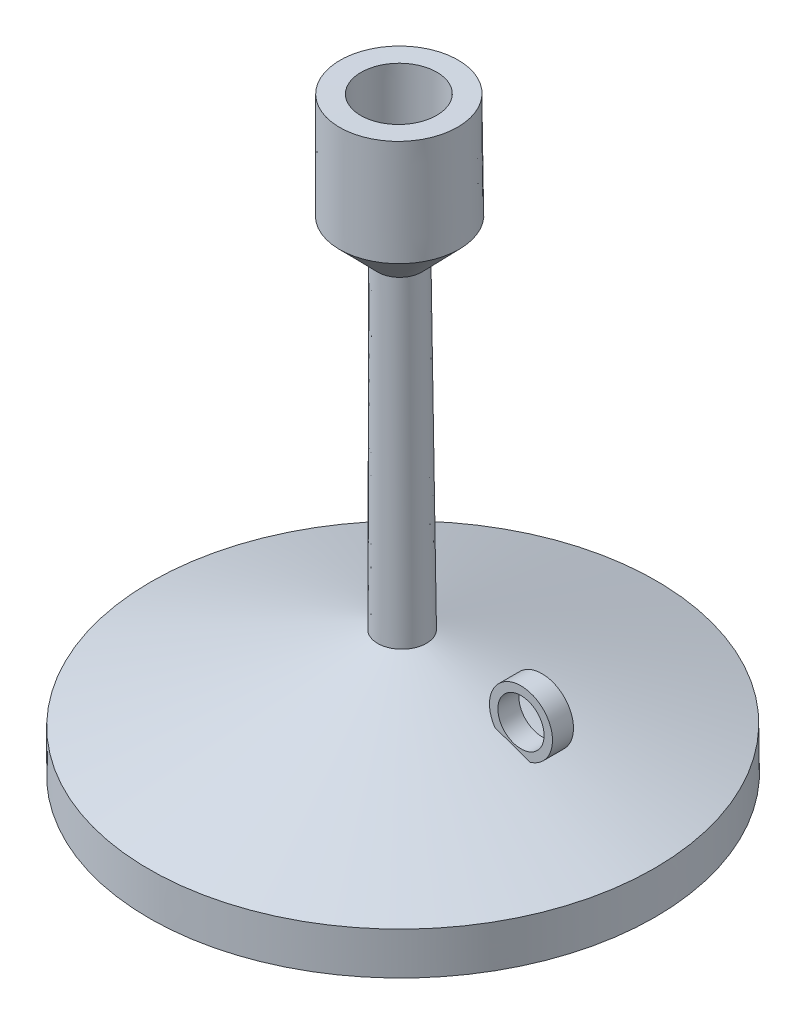
ISO-10303-21;
HEADER;
FILE_DESCRIPTION(('STEP AP214'),'2;1');
FILE_NAME('part.step','',(''),(''),'','','');
FILE_SCHEMA(('AUTOMOTIVE_DESIGN { 1 0 10303 214 1 1 1 1 }'));
ENDSEC;
DATA;
#1=APPLICATION_CONTEXT('core data for automotive mechanical design processes');
#2=APPLICATION_PROTOCOL_DEFINITION('international standard','automotive_design',2000,#1);
#3=PRODUCT_CONTEXT('',#1,'mechanical');
#4=PRODUCT('Part','Part','',(#3));
#5=PRODUCT_RELATED_PRODUCT_CATEGORY('part','',(#4));
#6=PRODUCT_DEFINITION_FORMATION('','',#4);
#7=PRODUCT_DEFINITION_CONTEXT('part definition',#1,'design');
#8=PRODUCT_DEFINITION('design','',#6,#7);
#9=PRODUCT_DEFINITION_SHAPE('','',#8);
#10=(LENGTH_UNIT() NAMED_UNIT(*) SI_UNIT(.MILLI.,.METRE.));
#11=(NAMED_UNIT(*) PLANE_ANGLE_UNIT() SI_UNIT($,.RADIAN.));
#12=(NAMED_UNIT(*) SI_UNIT($,.STERADIAN.) SOLID_ANGLE_UNIT());
#13=UNCERTAINTY_MEASURE_WITH_UNIT(LENGTH_MEASURE(1.E-05),#10,'distance_accuracy_value','');
#14=(GEOMETRIC_REPRESENTATION_CONTEXT(3) GLOBAL_UNCERTAINTY_ASSIGNED_CONTEXT((#13)) GLOBAL_UNIT_ASSIGNED_CONTEXT((#10,
#11,#12)) REPRESENTATION_CONTEXT('',''));
#15=CARTESIAN_POINT('',(0.,0.,0.));
#16=DIRECTION('',(0.,0.,1.));
#17=DIRECTION('',(1.,0.,0.));
#18=AXIS2_PLACEMENT_3D('',#15,#16,#17);
#19=CARTESIAN_POINT('',(-0.21413534278094,30.0412419072249,0.));
#20=DIRECTION('',(0.00712786454183642,-0.999974596450866,0.));
#21=DIRECTION('',(0.999974596450867,0.00712786454183642,0.));
#22=AXIS2_PLACEMENT_3D('',#19,#20,#21);
#23=CONICAL_SURFACE('',#22,5.7860116424501,1.22321859968409);
#24=CARTESIAN_POINT('',(-0.0743252218633993,10.4271529435975,0.));
#25=DIRECTION('',(-0.00712786454183642,0.999974596450866,0.));
#26=DIRECTION('',(-0.999974596450867,-0.00712786454183642,0.));
#27=AXIS2_PLACEMENT_3D('',#24,#25,#26);
#28=CIRCLE('',#27,59.9271971416336);
#29=CARTESIAN_POINT('',(59.8513495562732,10.854305887195,0.));
#30=VERTEX_POINT('',#29);
#31=EDGE_CURVE('E134',#30,#30,#28,.T.);
#32=ORIENTED_EDGE('',*,*,#31,.T.);
#33=EDGE_LOOP('',(#32));
#34=FACE_BOUND('',#33,.T.);
#35=CARTESIAN_POINT('',(-0.21413534278094,30.0412419072249,0.));
#36=DIRECTION('',(-0.00712786454183642,0.999974596450866,0.));
#37=DIRECTION('',(-0.999974596450867,-0.00712786454183642,0.));
#38=AXIS2_PLACEMENT_3D('',#35,#36,#37);
#39=CIRCLE('',#38,5.7860116424501);
#40=CARTESIAN_POINT('',(5.57172931443811,30.0824838144498,0.));
#41=VERTEX_POINT('',#40);
#42=EDGE_CURVE('E131',#41,#41,#39,.T.);
#43=ORIENTED_EDGE('',*,*,#42,.F.);
#44=EDGE_LOOP('',(#43));
#45=FACE_BOUND('',#44,.T.);
#46=CARTESIAN_POINT('',(5.04891081975942,30.0640307314897,2.5));
#47=CARTESIAN_POINT('',(5.28734384962677,29.9878504830731,2.5));
#48=CARTESIAN_POINT('',(5.52551252785675,29.9108505560297,2.5));
#49=CARTESIAN_POINT('',(6.00142893454864,29.7555684221422,2.5));
#50=CARTESIAN_POINT('',(6.23917666764917,29.6772862295267,2.5));
#51=CARTESIAN_POINT('',(6.71435746752989,29.5197971748106,2.5));
#52=CARTESIAN_POINT('',(6.95179054306177,29.440590339055,2.5));
#53=CARTESIAN_POINT('',(7.42641765583831,29.2814615443595,2.5));
#54=CARTESIAN_POINT('',(7.66361169231417,29.2015395831277,2.5));
#55=CARTESIAN_POINT('',(8.37489911220813,28.9609580869443,2.5));
#56=CARTESIAN_POINT('',(8.84871459754817,28.7994773463564,2.5));
#57=CARTESIAN_POINT('',(9.7958747453301,28.475129498685,2.5));
#58=CARTESIAN_POINT('',(10.2692194033464,28.3122623787052,2.5));
#59=CARTESIAN_POINT('',(11.2155232528894,27.9856087769122,2.5));
#60=CARTESIAN_POINT('',(11.6884824860931,27.8218224157825,2.5));
#61=CARTESIAN_POINT('',(12.6341703233451,27.4935850347221,2.5));
#62=CARTESIAN_POINT('',(13.1068989273011,27.3291340145257,2.5));
#63=CARTESIAN_POINT('',(14.5248358630049,26.8350634367699,2.5));
#64=CARTESIAN_POINT('',(15.4697942468742,26.5047267330454,2.5));
#65=CARTESIAN_POINT('',(17.3593267340839,25.8429594471364,2.5));
#66=CARTESIAN_POINT('',(18.3039008377017,25.5115288657433,2.5));
#67=CARTESIAN_POINT('',(20.1928015274494,24.8479654604727,2.5));
#68=CARTESIAN_POINT('',(21.137128113763,24.5158326371184,2.5));
#69=CARTESIAN_POINT('',(23.9699594214102,23.5187127492544,2.5));
#70=CARTESIAN_POINT('',(25.8582217532005,22.853037229397,2.5));
#71=CARTESIAN_POINT('',(29.6344188740308,21.5207635866905,2.5));
#72=CARTESIAN_POINT('',(31.522353663357,20.8541654646518,2.5));
#73=CARTESIAN_POINT('',(35.300849602286,19.519424578357,2.5));
#74=CARTESIAN_POINT('',(37.1914104622537,18.8512809941992,2.5));
#75=CARTESIAN_POINT('',(40.972410621923,17.5146481782379,2.5));
#76=CARTESIAN_POINT('',(42.8628499215875,16.8461589463293,2.5));
#77=CARTESIAN_POINT('',(46.6435319735268,15.5089896605931,2.5));
#78=CARTESIAN_POINT('',(48.5337747307675,14.8403096208053,2.5));
#79=CARTESIAN_POINT('',(52.3142003715482,13.5027823062783,2.5));
#80=CARTESIAN_POINT('',(54.2043832551079,12.8339350315947,2.5));
#81=CARTESIAN_POINT('',(56.0945478091168,12.1650359814455,2.5));
#82=B_SPLINE_CURVE_WITH_KNOTS('',3,(#46,#47,#48,#49,#50,#51,#52,#53,#54,#55,#56,#57,#58,#59,#60,
#61,#62,#63,#64,#65,#66,#67,#68,#69,#70,#71,#72,#73,#74,#75,#76,#77,#78,#79,#80,#81),
.UNSPECIFIED.,.F.,.F.,(4,2,2,2,2,2,2,2,2,2,2,2,2,2,2,2,2,4),(0.,0.750917037525534,
1.50182574815104,2.25271311572947,3.00360289066609,4.50532934571247,6.00706978538224,
7.50861747597364,9.01016576648145,12.0132657498291,15.0163635609353,18.0194591354521,
24.0259489450973,30.0324334821413,36.0478906689133,42.0633496852419,48.0784436976561,
54.0935357120179),.UNSPECIFIED.);
#83=CARTESIAN_POINT('',(24.3670332755584,23.378467016646,2.5));
#84=VERTEX_POINT('',#83);
#85=CARTESIAN_POINT('',(32.7582895513485,20.4175625697965,2.5));
#86=VERTEX_POINT('',#85);
#87=EDGE_CURVE('E47',#84,#86,#82,.T.);
#88=ORIENTED_EDGE('',*,*,#87,.F.);
#89=CARTESIAN_POINT('',(24.3851028440401,23.3519788518221,3.00019999999996));
#90=CARTESIAN_POINT('',(24.375221586923,23.3664030651678,2.75043573899286));
#91=CARTESIAN_POINT('',(24.3666296074578,23.3790422719816,2.50052254236208));
#92=CARTESIAN_POINT('',(24.351960654244,23.4007280965011,2.000467217478));
#93=CARTESIAN_POINT('',(24.345883673398,23.4097747243449,1.75032508987275));
#94=CARTESIAN_POINT('',(24.3313419738318,23.4314738652983,1.0002828390202));
#95=CARTESIAN_POINT('',(24.3265420941038,23.4387218368775,0.5001414195101));
#96=CARTESIAN_POINT('',(24.3265420941038,23.4387218368775,-0.500141419510101));
#97=CARTESIAN_POINT('',(24.3313419738318,23.4314738652983,-1.0002828390202));
#98=CARTESIAN_POINT('',(24.345883673398,23.4097747243449,-1.75032508987275));
#99=CARTESIAN_POINT('',(24.351960654244,23.4007280965011,-2.000467217478));
#100=CARTESIAN_POINT('',(24.3666296074578,23.3790422719816,-2.50052254236208));
#101=CARTESIAN_POINT('',(24.375221586923,23.3664030651678,-2.75043573899287));
#102=CARTESIAN_POINT('',(24.3851028440401,23.3519788518221,-3.00019999999996));
#103=B_SPLINE_CURVE_WITH_KNOTS('',3,(#89,#90,#91,#92,#93,#94,#95,#96,#97,#98,#99,#100,#101,
#102),.UNSPECIFIED.,.F.,.F.,(4,2,2,2,2,2,4),(0.,0.751106667417619,1.50221121522338,
3.00254051267487,4.50286981012636,5.25397435793212,6.00508102534974),.UNSPECIFIED.);
#104=CARTESIAN_POINT('',(24.3670332755584,23.378467016646,-2.5));
#105=VERTEX_POINT('',#104);
#106=EDGE_CURVE('E11',#84,#105,#103,.T.);
#107=ORIENTED_EDGE('',*,*,#106,.T.);
#108=CARTESIAN_POINT('',(5.04891081975942,30.0640307314897,-2.5));
#109=CARTESIAN_POINT('',(5.28734384962677,29.9878504830731,-2.5));
#110=CARTESIAN_POINT('',(5.52551252785675,29.9108505560297,-2.5));
#111=CARTESIAN_POINT('',(6.00142893454864,29.7555684221422,-2.5));
#112=CARTESIAN_POINT('',(6.23917666764917,29.6772862295267,-2.5));
#113=CARTESIAN_POINT('',(6.71435746752989,29.5197971748106,-2.5));
#114=CARTESIAN_POINT('',(6.95179054306177,29.440590339055,-2.5));
#115=CARTESIAN_POINT('',(7.42641765583831,29.2814615443595,-2.5));
#116=CARTESIAN_POINT('',(7.66361169231417,29.2015395831277,-2.5));
#117=CARTESIAN_POINT('',(8.37489911220813,28.9609580869443,-2.5));
#118=CARTESIAN_POINT('',(8.84871459754817,28.7994773463564,-2.5));
#119=CARTESIAN_POINT('',(9.7958747453301,28.475129498685,-2.5));
#120=CARTESIAN_POINT('',(10.2692194033464,28.3122623787052,-2.5));
#121=CARTESIAN_POINT('',(11.2155232528894,27.9856087769122,-2.5));
#122=CARTESIAN_POINT('',(11.6884824860931,27.8218224157825,-2.5));
#123=CARTESIAN_POINT('',(12.6341703233451,27.4935850347221,-2.5));
#124=CARTESIAN_POINT('',(13.1068989273011,27.3291340145257,-2.5));
#125=CARTESIAN_POINT('',(14.5248358630049,26.8350634367699,-2.5));
#126=CARTESIAN_POINT('',(15.4697942468742,26.5047267330454,-2.5));
#127=CARTESIAN_POINT('',(17.3593267340839,25.8429594471364,-2.5));
#128=CARTESIAN_POINT('',(18.3039008377017,25.5115288657433,-2.5));
#129=CARTESIAN_POINT('',(20.1928015274494,24.8479654604727,-2.5));
#130=CARTESIAN_POINT('',(21.137128113763,24.5158326371184,-2.5));
#131=CARTESIAN_POINT('',(23.9699594214102,23.5187127492544,-2.5));
#132=CARTESIAN_POINT('',(25.8582217532005,22.853037229397,-2.5));
#133=CARTESIAN_POINT('',(29.6344188740308,21.5207635866905,-2.5));
#134=CARTESIAN_POINT('',(31.522353663357,20.8541654646518,-2.5));
#135=CARTESIAN_POINT('',(35.300849602286,19.519424578357,-2.5));
#136=CARTESIAN_POINT('',(37.1914104622537,18.8512809941992,-2.5));
#137=CARTESIAN_POINT('',(40.972410621923,17.5146481782379,-2.5));
#138=CARTESIAN_POINT('',(42.8628499215875,16.8461589463293,-2.5));
#139=CARTESIAN_POINT('',(46.6435319735268,15.5089896605931,-2.5));
#140=CARTESIAN_POINT('',(48.5337747307675,14.8403096208053,-2.5));
#141=CARTESIAN_POINT('',(52.3142003715482,13.5027823062783,-2.5));
#142=CARTESIAN_POINT('',(54.2043832551079,12.8339350315947,-2.5));
#143=CARTESIAN_POINT('',(56.0945478091168,12.1650359814455,-2.5));
#144=B_SPLINE_CURVE_WITH_KNOTS('',3,(#108,#109,#110,#111,#112,#113,#114,#115,#116,#117,#118,
#119,#120,#121,#122,#123,#124,#125,#126,#127,#128,#129,#130,#131,#132,#133,#134,#135,#136,#137,
#138,#139,#140,#141,#142,#143),.UNSPECIFIED.,.F.,.F.,(4,2,2,2,2,2,2,2,2,2,2,2,2,2,2,2,2,4),(0.,
0.750917037525534,1.50182574815104,2.25271311572947,3.00360289066609,4.50532934571247,
6.00706978538224,7.50861747597364,9.01016576648145,12.0132657498291,15.0163635609353,
18.0194591354521,24.0259489450973,30.0324334821413,36.0478906689133,42.0633496852419,
48.0784436976561,54.0935357120179),.UNSPECIFIED.);
#145=CARTESIAN_POINT('',(32.7582895513485,20.4175625697965,-2.5));
#146=VERTEX_POINT('',#145);
#147=EDGE_CURVE('E82',#105,#146,#144,.T.);
#148=ORIENTED_EDGE('',*,*,#147,.T.);
#149=CARTESIAN_POINT('',(32.7353324775368,20.4106057794333,-3.0002));
#150=CARTESIAN_POINT('',(32.7603716257525,20.4181862194935,-2.50045135283835));
#151=CARTESIAN_POINT('',(32.779038465879,20.4239165459468,-2.0003621491806));
#152=CARTESIAN_POINT('',(32.803840015477,20.4315830704133,-1.00018181015674));
#153=CARTESIAN_POINT('',(32.8099831964928,20.4335218331679,-0.500090905078371));
#154=CARTESIAN_POINT('',(32.8099831964928,20.4335218331679,0.500090905078372));
#155=CARTESIAN_POINT('',(32.803840015477,20.4315830704133,1.00018181015674));
#156=CARTESIAN_POINT('',(32.779038465879,20.4239165459468,2.0003621491806));
#157=CARTESIAN_POINT('',(32.7603716257525,20.4181862194935,2.50045135283835));
#158=CARTESIAN_POINT('',(32.7353324775368,20.4106057794333,3.0002));
#159=B_SPLINE_CURVE_WITH_KNOTS('',3,(#149,#150,#151,#152,#153,#154,#155,#156,#157,#158),
.UNSPECIFIED.,.F.,.F.,(4,2,2,2,4),(0.,1.50124422956585,3.00147261525299,4.50170100094013,
6.00294523050598),.UNSPECIFIED.);
#160=EDGE_CURVE('E81',#146,#86,#159,.T.);
#161=ORIENTED_EDGE('',*,*,#160,.T.);
#162=EDGE_LOOP('',(#88,#107,#148,#161));
#163=FACE_BOUND('',#162,.T.);
#164=ADVANCED_FACE('F33',(#34,#45,#163),#23,.T.);
#165=CARTESIAN_POINT('',(-0.855365474339225,120.,0.));
#166=DIRECTION('',(-0.00712786454183642,0.999974596450866,0.));
#167=DIRECTION('',(-0.999974596450867,-0.00712786454183642,0.));
#168=AXIS2_PLACEMENT_3D('',#165,#166,#167);
#169=CONICAL_SURFACE('',#168,0.,1.56366840189476);
#170=CARTESIAN_POINT('',(-0.855830080782786,120.065180060337,0.));
#171=DIRECTION('',(-0.00712786454183642,0.999974596450866,0.));
#172=DIRECTION('',(-0.999974596450867,-0.00712786454183642,0.));
#173=AXIS2_PLACEMENT_3D('',#170,#171,#172);
#174=CIRCLE('',#173,9.1444022194883);
#175=CARTESIAN_POINT('',(8.28833983843443,120.130360120673,0.));
#176=VERTEX_POINT('',#175);
#177=EDGE_CURVE('E116',#176,#176,#174,.T.);
#178=ORIENTED_EDGE('',*,*,#177,.T.);
#179=EDGE_LOOP('',(#178));
#180=FACE_BOUND('',#179,.T.);
#181=CARTESIAN_POINT('',(-0.855365474339225,120.,0.));
#182=VERTEX_POINT('',#181);
#183=VERTEX_LOOP('',#182);
#184=FACE_BOUND('',#183,.T.);
#185=ADVANCED_FACE('F35',(#180,#184),#169,.F.);
#186=CARTESIAN_POINT('',(-0.855830080782786,120.065180060337,0.));
#187=DIRECTION('',(0.00712786454183642,-0.999974596450866,0.));
#188=DIRECTION('',(0.999974596450867,0.00712786454183642,0.));
#189=AXIS2_PLACEMENT_3D('',#186,#187,#188);
#190=CONICAL_SURFACE('',#189,9.1444022194883,0.0071279249001355);
#191=CARTESIAN_POINT('',(-0.998383750158372,140.064163931278,0.));
#192=DIRECTION('',(-0.00712786454183642,0.999974596450866,0.));
#193=DIRECTION('',(-0.999974596450867,-0.00712786454183642,0.));
#194=AXIS2_PLACEMENT_3D('',#191,#192,#193);
#195=CIRCLE('',#194,9.00184492865157);
#196=CARTESIAN_POINT('',(8.00323249968326,140.128327862556,0.));
#197=VERTEX_POINT('',#196);
#198=EDGE_CURVE('E119',#197,#197,#195,.T.);
#199=CARTESIAN_POINT('',(8.00323249968326,140.128327862556,0.));
#200=CARTESIAN_POINT('',(8.00620236779525,139.920015698578,0.));
#201=CARTESIAN_POINT('',(8.00917223590724,139.7117035346,0.));
#202=CARTESIAN_POINT('',(8.01511197213122,139.295079206644,0.));
#203=CARTESIAN_POINT('',(8.01808184024322,139.086767042666,0.));
#204=CARTESIAN_POINT('',(8.0240215764672,138.67014271471,0.));
#205=CARTESIAN_POINT('',(8.02699144457919,138.461830550733,0.));
#206=CARTESIAN_POINT('',(8.03293118080317,138.045206222777,0.));
#207=CARTESIAN_POINT('',(8.03590104891516,137.836894058799,0.));
#208=CARTESIAN_POINT('',(8.04184078513915,137.420269730843,0.));
#209=CARTESIAN_POINT('',(8.04481065325114,137.211957566865,0.));
#210=CARTESIAN_POINT('',(8.05075038947512,136.795333238909,0.));
#211=CARTESIAN_POINT('',(8.05372025758711,136.587021074931,0.));
#212=CARTESIAN_POINT('',(8.0596599938111,136.170396746975,0.));
#213=CARTESIAN_POINT('',(8.06262986192309,135.962084582997,0.));
#214=CARTESIAN_POINT('',(8.06856959814707,135.545460255041,0.));
#215=CARTESIAN_POINT('',(8.07153946625906,135.337148091063,0.));
#216=CARTESIAN_POINT('',(8.07747920248304,134.920523763107,0.));
#217=CARTESIAN_POINT('',(8.08044907059504,134.712211599129,0.));
#218=CARTESIAN_POINT('',(8.08638880681902,134.295587271174,0.));
#219=CARTESIAN_POINT('',(8.08935867493101,134.087275107196,0.));
#220=CARTESIAN_POINT('',(8.09529841115499,133.67065077924,0.));
#221=CARTESIAN_POINT('',(8.09826827926698,133.462338615262,0.));
#222=CARTESIAN_POINT('',(8.10420801549097,133.045714287306,0.));
#223=CARTESIAN_POINT('',(8.10717788360296,132.837402123328,0.));
#224=CARTESIAN_POINT('',(8.11311761982694,132.420777795372,0.));
#225=CARTESIAN_POINT('',(8.11608748793893,132.212465631394,0.));
#226=CARTESIAN_POINT('',(8.12202722416292,131.795841303438,0.));
#227=CARTESIAN_POINT('',(8.12499709227491,131.58752913946,0.));
#228=CARTESIAN_POINT('',(8.13093682849889,131.170904811504,0.));
#229=CARTESIAN_POINT('',(8.13390669661088,130.962592647526,0.));
#230=CARTESIAN_POINT('',(8.13984643283486,130.545968319571,0.));
#231=CARTESIAN_POINT('',(8.14281630094685,130.337656155593,0.));
#232=CARTESIAN_POINT('',(8.14875603717084,129.921031827637,0.));
#233=CARTESIAN_POINT('',(8.15172590528283,129.712719663659,0.));
#234=CARTESIAN_POINT('',(8.15766564150681,129.296095335703,0.));
#235=CARTESIAN_POINT('',(8.1606355096188,129.087783171725,0.));
#236=CARTESIAN_POINT('',(8.16657524584279,128.671158843769,0.));
#237=CARTESIAN_POINT('',(8.16954511395478,128.462846679791,0.));
#238=CARTESIAN_POINT('',(8.17548485017876,128.046222351835,0.));
#239=CARTESIAN_POINT('',(8.17845471829075,127.837910187857,0.));
#240=CARTESIAN_POINT('',(8.18439445451473,127.421285859901,0.));
#241=CARTESIAN_POINT('',(8.18736432262672,127.212973695923,0.));
#242=CARTESIAN_POINT('',(8.19330405885071,126.796349367967,0.));
#243=CARTESIAN_POINT('',(8.1962739269627,126.58803720399,0.));
#244=CARTESIAN_POINT('',(8.20221366318668,126.171412876034,0.));
#245=CARTESIAN_POINT('',(8.20518353129867,125.963100712056,0.));
#246=CARTESIAN_POINT('',(8.21112326752266,125.5464763841,0.));
#247=CARTESIAN_POINT('',(8.21409313563465,125.338164220122,0.));
#248=CARTESIAN_POINT('',(8.22003287185863,124.921539892166,0.));
#249=CARTESIAN_POINT('',(8.22300273997062,124.713227728188,0.));
#250=CARTESIAN_POINT('',(8.2289424761946,124.296603400232,0.));
#251=CARTESIAN_POINT('',(8.2319123443066,124.088291236254,0.));
#252=CARTESIAN_POINT('',(8.23785208053058,123.671666908298,0.));
#253=CARTESIAN_POINT('',(8.24082194864257,123.46335474432,0.));
#254=CARTESIAN_POINT('',(8.24676168486655,123.046730416364,0.));
#255=CARTESIAN_POINT('',(8.24973155297854,122.838418252386,0.));
#256=CARTESIAN_POINT('',(8.25567128920253,122.421793924431,0.));
#257=CARTESIAN_POINT('',(8.25864115731452,122.213481760453,0.));
#258=CARTESIAN_POINT('',(8.2645808935385,121.796857432497,0.));
#259=CARTESIAN_POINT('',(8.26755076165049,121.588545268519,0.));
#260=CARTESIAN_POINT('',(8.27349049787447,121.171920940563,0.));
#261=CARTESIAN_POINT('',(8.27646036598647,120.963608776585,0.));
#262=CARTESIAN_POINT('',(8.28240010221045,120.546984448629,0.));
#263=CARTESIAN_POINT('',(8.28536997032244,120.338672284651,0.));
#264=CARTESIAN_POINT('',(8.28833983843443,120.130360120673,0.));
#265=B_SPLINE_CURVE_WITH_KNOTS('',3,(#199,#200,#201,#202,#203,#204,#205,#206,#207,#208,#209,
#210,#211,#212,#213,#214,#215,#216,#217,#218,#219,#220,#221,#222,#223,#224,#225,#226,#227,#228,
#229,#230,#231,#232,#233,#234,#235,#236,#237,#238,#239,#240,#241,#242,#243,#244,#245,#246,#247,
#248,#249,#250,#251,#252,#253,#254,#255,#256,#257,#258,#259,#260,#261,#262,#263,#264),
.UNSPECIFIED.,.F.,.F.,(4,2,2,2,2,2,2,2,2,2,2,2,2,2,2,2,2,2,2,2,2,2,2,2,2,2,2,2,2,2,2,2,4),(0.,
0.624999999999978,1.24999999999998,1.87499999999999,2.5,3.125,3.74999999999998,4.37499999999999,
4.99999999999999,5.625,6.24999999999998,6.87499999999998,7.49999999999999,8.12499999999999,
8.74999999999997,9.37499999999998,9.99999999999998,10.625,11.25,11.875,12.5,13.125,13.75,14.375,
15.,15.625,16.25,16.875,17.5,18.125,18.75,19.375,20.),.UNSPECIFIED.);
#266=EDGE_CURVE('BSEAM158',#197,#176,#265,.T.);
#267=ORIENTED_EDGE('',*,*,#198,.T.);
#268=ORIENTED_EDGE('',*,*,#177,.F.);
#269=ORIENTED_EDGE('',*,*,#266,.T.);
#270=ORIENTED_EDGE('',*,*,#266,.F.);
#271=EDGE_LOOP('',(#267,#269,#268,#270));
#272=FACE_BOUND('',#271,.T.);
#273=ADVANCED_FACE('F158',(#272),#190,.F.);
#274=CARTESIAN_POINT('',(-0.998383750158372,140.064163931278,0.));
#275=DIRECTION('',(-0.00712786454183642,0.999974596450866,0.));
#276=DIRECTION('',(-0.999974596450867,-0.00712786454183642,0.));
#277=AXIS2_PLACEMENT_3D('',#274,#275,#276);
#278=CONICAL_SURFACE('',#277,9.00184492865156,1.56366840189476);
#279=CARTESIAN_POINT('',(-0.998637782423006,140.099802348622,0.));
#280=DIRECTION('',(-0.00712786454183642,0.999974596450866,0.));
#281=DIRECTION('',(-0.999974596450867,-0.00712786454183642,0.));
#282=AXIS2_PLACEMENT_3D('',#279,#280,#281);
#283=CIRCLE('',#282,14.0017179109059);
#284=CARTESIAN_POINT('',(13.002724435154,140.199604697244,0.));
#285=VERTEX_POINT('',#284);
#286=EDGE_CURVE('E122',#285,#285,#283,.T.);
#287=ORIENTED_EDGE('',*,*,#286,.T.);
#288=EDGE_LOOP('',(#287));
#289=FACE_BOUND('',#288,.T.);
#290=ORIENTED_EDGE('',*,*,#198,.F.);
#291=EDGE_LOOP('',(#290));
#292=FACE_BOUND('',#291,.T.);
#293=ADVANCED_FACE('F179',(#289,#292),#278,.F.);
#294=CARTESIAN_POINT('',(-0.998637782423006,140.099802348622,0.));
#295=DIRECTION('',(0.00712786454183642,-0.999974596450866,0.));
#296=DIRECTION('',(0.999974596450867,0.00712786454183642,0.));
#297=AXIS2_PLACEMENT_3D('',#294,#295,#296);
#298=CONICAL_SURFACE('',#297,14.0017179109059,0.00712792490013531);
#299=CARTESIAN_POINT('',(-0.820445695703523,115.101072509945,0.));
#300=DIRECTION('',(-0.00712786454183642,0.999974596450866,0.));
#301=DIRECTION('',(-0.999974596450867,-0.00712786454183642,0.));
#302=AXIS2_PLACEMENT_3D('',#299,#300,#301);
#303=CIRCLE('',#302,14.1799145244518);
#304=CARTESIAN_POINT('',(13.359108608593,115.20214501989,0.));
#305=VERTEX_POINT('',#304);
#306=EDGE_CURVE('E125',#305,#305,#303,.T.);
#307=CARTESIAN_POINT('',(13.359108608593,115.20214501989,0.));
#308=CARTESIAN_POINT('',(13.355396273453,115.462535224863,0.));
#309=CARTESIAN_POINT('',(13.351683938313,115.722925429835,0.));
#310=CARTESIAN_POINT('',(13.344259268033,116.24370583978,0.));
#311=CARTESIAN_POINT('',(13.340546932893,116.504096044752,0.));
#312=CARTESIAN_POINT('',(13.333122262613,117.024876454697,0.));
#313=CARTESIAN_POINT('',(13.329409927473,117.28526665967,0.));
#314=CARTESIAN_POINT('',(13.3219852571931,117.806047069615,0.));
#315=CARTESIAN_POINT('',(13.3182729220531,118.066437274587,0.));
#316=CARTESIAN_POINT('',(13.3108482517731,118.587217684532,0.));
#317=CARTESIAN_POINT('',(13.3071359166331,118.847607889504,0.));
#318=CARTESIAN_POINT('',(13.2997112463531,119.368388299449,0.));
#319=CARTESIAN_POINT('',(13.2959989112131,119.628778504422,0.));
#320=CARTESIAN_POINT('',(13.2885742409332,120.149558914366,0.));
#321=CARTESIAN_POINT('',(13.2848619057932,120.409949119339,0.));
#322=CARTESIAN_POINT('',(13.2774372355132,120.930729529284,0.));
#323=CARTESIAN_POINT('',(13.2737249003732,121.191119734256,0.));
#324=CARTESIAN_POINT('',(13.2663002300932,121.711900144201,0.));
#325=CARTESIAN_POINT('',(13.2625878949532,121.972290349174,0.));
#326=CARTESIAN_POINT('',(13.2551632246733,122.493070759118,0.));
#327=CARTESIAN_POINT('',(13.2514508895333,122.753460964091,0.));
#328=CARTESIAN_POINT('',(13.2440262192533,123.274241374036,0.));
#329=CARTESIAN_POINT('',(13.2403138841133,123.534631579008,0.));
#330=CARTESIAN_POINT('',(13.2328892138333,124.055411988953,0.));
#331=CARTESIAN_POINT('',(13.2291768786933,124.315802193925,0.));
#332=CARTESIAN_POINT('',(13.2217522084134,124.83658260387,0.));
#333=CARTESIAN_POINT('',(13.2180398732734,125.096972808843,0.));
#334=CARTESIAN_POINT('',(13.2106152029934,125.617753218788,0.));
#335=CARTESIAN_POINT('',(13.2069028678534,125.87814342376,0.));
#336=CARTESIAN_POINT('',(13.1994781975734,126.398923833705,0.));
#337=CARTESIAN_POINT('',(13.1957658624334,126.659314038677,0.));
#338=CARTESIAN_POINT('',(13.1883411921534,127.180094448622,0.));
#339=CARTESIAN_POINT('',(13.1846288570135,127.440484653595,0.));
#340=CARTESIAN_POINT('',(13.1772041867335,127.961265063539,0.));
#341=CARTESIAN_POINT('',(13.1734918515935,128.221655268512,0.));
#342=CARTESIAN_POINT('',(13.1660671813135,128.742435678457,0.));
#343=CARTESIAN_POINT('',(13.1623548461735,129.002825883429,0.));
#344=CARTESIAN_POINT('',(13.1549301758935,129.523606293374,0.));
#345=CARTESIAN_POINT('',(13.1512178407536,129.783996498347,0.));
#346=CARTESIAN_POINT('',(13.1437931704736,130.304776908291,0.));
#347=CARTESIAN_POINT('',(13.1400808353336,130.565167113264,0.));
#348=CARTESIAN_POINT('',(13.1326561650536,131.085947523209,0.));
#349=CARTESIAN_POINT('',(13.1289438299136,131.346337728181,0.));
#350=CARTESIAN_POINT('',(13.1215191596336,131.867118138126,0.));
#351=CARTESIAN_POINT('',(13.1178068244937,132.127508343098,0.));
#352=CARTESIAN_POINT('',(13.1103821542137,132.648288753043,0.));
#353=CARTESIAN_POINT('',(13.1066698190737,132.908678958016,0.));
#354=CARTESIAN_POINT('',(13.0992451487937,133.429459367961,0.));
#355=CARTESIAN_POINT('',(13.0955328136537,133.689849572933,0.));
#356=CARTESIAN_POINT('',(13.0881081433737,134.210629982878,0.));
#357=CARTESIAN_POINT('',(13.0843958082338,134.47102018785,0.));
#358=CARTESIAN_POINT('',(13.0769711379538,134.991800597795,0.));
#359=CARTESIAN_POINT('',(13.0732588028138,135.252190802768,0.));
#360=CARTESIAN_POINT('',(13.0658341325338,135.772971212713,0.));
#361=CARTESIAN_POINT('',(13.0621217973938,136.033361417685,0.));
#362=CARTESIAN_POINT('',(13.0546971271138,136.55414182763,0.));
#363=CARTESIAN_POINT('',(13.0509847919739,136.814532032602,0.));
#364=CARTESIAN_POINT('',(13.0435601216939,137.335312442547,0.));
#365=CARTESIAN_POINT('',(13.0398477865539,137.59570264752,0.));
#366=CARTESIAN_POINT('',(13.0324231162739,138.116483057464,0.));
#367=CARTESIAN_POINT('',(13.0287107811339,138.376873262437,0.));
#368=CARTESIAN_POINT('',(13.0212861108539,138.897653672382,0.));
#369=CARTESIAN_POINT('',(13.0175737757139,139.158043877354,0.));
#370=CARTESIAN_POINT('',(13.010149105434,139.678824287299,0.));
#371=CARTESIAN_POINT('',(13.006436770294,139.939214492271,0.));
#372=CARTESIAN_POINT('',(13.002724435154,140.199604697244,0.));
#373=B_SPLINE_CURVE_WITH_KNOTS('',3,(#307,#308,#309,#310,#311,#312,#313,#314,#315,#316,#317,
#318,#319,#320,#321,#322,#323,#324,#325,#326,#327,#328,#329,#330,#331,#332,#333,#334,#335,#336,
#337,#338,#339,#340,#341,#342,#343,#344,#345,#346,#347,#348,#349,#350,#351,#352,#353,#354,#355,
#356,#357,#358,#359,#360,#361,#362,#363,#364,#365,#366,#367,#368,#369,#370,#371,#372),
.UNSPECIFIED.,.F.,.F.,(4,2,2,2,2,2,2,2,2,2,2,2,2,2,2,2,2,2,2,2,2,2,2,2,2,2,2,2,2,2,2,2,4),(0.,
0.781249999999993,1.5625,2.34374999999999,3.125,3.90624999999998,4.68749999999999,
5.46875000000001,6.24999999999999,7.03125000000001,7.81249999999999,8.59375,9.37499999999998,
10.15625,10.9375,11.71875,12.5,13.28125,14.0625,14.84375,15.625,16.40625,17.1875,17.96875,18.75,
19.53125,20.3125,21.09375,21.875,22.65625,23.4375,24.21875,25.),.UNSPECIFIED.);
#374=EDGE_CURVE('BSEAM173',#305,#285,#373,.T.);
#375=ORIENTED_EDGE('',*,*,#306,.T.);
#376=ORIENTED_EDGE('',*,*,#286,.F.);
#377=ORIENTED_EDGE('',*,*,#374,.T.);
#378=ORIENTED_EDGE('',*,*,#374,.F.);
#379=EDGE_LOOP('',(#375,#377,#376,#378));
#380=FACE_BOUND('',#379,.T.);
#381=ADVANCED_FACE('F173',(#380),#298,.T.);
#382=CARTESIAN_POINT('',(-0.820445695703523,115.101072509945,0.));
#383=DIRECTION('',(-0.00712786454183642,0.999974596450866,0.));
#384=DIRECTION('',(-0.999974596450867,-0.00712786454183642,0.));
#385=AXIS2_PLACEMENT_3D('',#382,#383,#384);
#386=CONICAL_SURFACE('',#385,14.1799145244518,0.778270238497313);
#387=CARTESIAN_POINT('',(-0.755839286408168,106.037380616802,0.));
#388=DIRECTION('',(-0.00712786454183642,0.999974596450866,0.));
#389=DIRECTION('',(-0.999974596450867,-0.00712786454183642,0.));
#390=AXIS2_PLACEMENT_3D('',#387,#388,#389);
#391=CIRCLE('',#390,5.24429393727054);
#392=CARTESIAN_POINT('',(4.48832142718366,106.074761233605,0.));
#393=VERTEX_POINT('',#392);
#394=EDGE_CURVE('E128',#393,#393,#391,.T.);
#395=ORIENTED_EDGE('',*,*,#394,.T.);
#396=EDGE_LOOP('',(#395));
#397=FACE_BOUND('',#396,.T.);
#398=ORIENTED_EDGE('',*,*,#306,.F.);
#399=EDGE_LOOP('',(#398));
#400=FACE_BOUND('',#399,.T.);
#401=ADVANCED_FACE('F168',(#397,#400),#386,.T.);
#402=CARTESIAN_POINT('',(-0.755839286408168,106.037380616802,0.));
#403=DIRECTION('',(0.00712786454183642,-0.999974596450866,0.));
#404=DIRECTION('',(0.999974596450867,0.00712786454183642,0.));
#405=AXIS2_PLACEMENT_3D('',#402,#403,#404);
#406=CONICAL_SURFACE('',#405,5.24429393727054,0.00712792490013535);
#407=CARTESIAN_POINT('',(5.57172931443811,30.0824838144498,0.));
#408=CARTESIAN_POINT('',(5.56044381561255,30.874070037566,0.));
#409=CARTESIAN_POINT('',(5.54915831678698,31.6656562606821,0.));
#410=CARTESIAN_POINT('',(5.52658731913584,33.2488287069146,0.));
#411=CARTESIAN_POINT('',(5.51530182031028,34.0404149300307,0.));
#412=CARTESIAN_POINT('',(5.49273082265914,35.6235873762632,0.));
#413=CARTESIAN_POINT('',(5.48144532383357,36.4151735993794,0.));
#414=CARTESIAN_POINT('',(5.45887432618244,37.9983460456117,0.));
#415=CARTESIAN_POINT('',(5.44758882735687,38.7899322687279,0.));
#416=CARTESIAN_POINT('',(5.42501782970574,40.3731047149603,0.));
#417=CARTESIAN_POINT('',(5.41373233088017,41.1646909380765,0.));
#418=CARTESIAN_POINT('',(5.39116133322904,42.7478633843089,0.));
#419=CARTESIAN_POINT('',(5.37987583440347,43.5394496074251,0.));
#420=CARTESIAN_POINT('',(5.35730483675234,45.1226220536575,0.));
#421=CARTESIAN_POINT('',(5.34601933792677,45.9142082767737,0.));
#422=CARTESIAN_POINT('',(5.32344834027564,47.4973807230061,0.));
#423=CARTESIAN_POINT('',(5.31216284145007,48.2889669461223,0.));
#424=CARTESIAN_POINT('',(5.28959184379893,49.8721393923547,0.));
#425=CARTESIAN_POINT('',(5.27830634497337,50.6637256154709,0.));
#426=CARTESIAN_POINT('',(5.25573534732223,52.2468980617033,0.));
#427=CARTESIAN_POINT('',(5.24444984849666,53.0384842848195,0.));
#428=CARTESIAN_POINT('',(5.22187885084553,54.6216567310519,0.));
#429=CARTESIAN_POINT('',(5.21059335201996,55.4132429541681,0.));
#430=CARTESIAN_POINT('',(5.18802235436883,56.9964154004005,0.));
#431=CARTESIAN_POINT('',(5.17673685554326,57.7880016235167,0.));
#432=CARTESIAN_POINT('',(5.15416585789213,59.3711740697491,0.));
#433=CARTESIAN_POINT('',(5.14288035906656,60.1627602928653,0.));
#434=CARTESIAN_POINT('',(5.12030936141542,61.7459327390977,0.));
#435=CARTESIAN_POINT('',(5.10902386258986,62.5375189622139,0.));
#436=CARTESIAN_POINT('',(5.08645286493872,64.1206914084463,0.));
#437=CARTESIAN_POINT('',(5.07516736611316,64.9122776315625,0.));
#438=CARTESIAN_POINT('',(5.05259636846202,66.4954500777949,0.));
#439=CARTESIAN_POINT('',(5.04131086963646,67.2870363009111,0.));
#440=CARTESIAN_POINT('',(5.01873987198532,68.8702087471435,0.));
#441=CARTESIAN_POINT('',(5.00745437315975,69.6617949702597,0.));
#442=CARTESIAN_POINT('',(4.98488337550862,71.2449674164921,0.));
#443=CARTESIAN_POINT('',(4.97359787668305,72.0365536396083,0.));
#444=CARTESIAN_POINT('',(4.95102687903192,73.6197260858407,0.));
#445=CARTESIAN_POINT('',(4.93974138020635,74.4113123089569,0.));
#446=CARTESIAN_POINT('',(4.91717038255522,75.9944847551893,0.));
#447=CARTESIAN_POINT('',(4.90588488372965,76.7860709783055,0.));
#448=CARTESIAN_POINT('',(4.88331388607852,78.3692434245379,0.));
#449=CARTESIAN_POINT('',(4.87202838725295,79.1608296476541,0.));
#450=CARTESIAN_POINT('',(4.84945738960181,80.7440020938865,0.));
#451=CARTESIAN_POINT('',(4.83817189077625,81.5355883170027,0.));
#452=CARTESIAN_POINT('',(4.81560089312511,83.1187607632351,0.));
#453=CARTESIAN_POINT('',(4.80431539429954,83.9103469863513,0.));
#454=CARTESIAN_POINT('',(4.78174439664841,85.4935194325837,0.));
#455=CARTESIAN_POINT('',(4.77045889782284,86.2851056556999,0.));
#456=CARTESIAN_POINT('',(4.74788790017171,87.8682781019323,0.));
#457=CARTESIAN_POINT('',(4.73660240134614,88.6598643250485,0.));
#458=CARTESIAN_POINT('',(4.71403140369501,90.2430367712809,0.));
#459=CARTESIAN_POINT('',(4.70274590486944,91.0346229943971,0.));
#460=CARTESIAN_POINT('',(4.6801749072183,92.6177954406295,0.));
#461=CARTESIAN_POINT('',(4.66888940839274,93.4093816637457,0.));
#462=CARTESIAN_POINT('',(4.6463184107416,94.9925541099781,0.));
#463=CARTESIAN_POINT('',(4.63503291191604,95.7841403330943,0.));
#464=CARTESIAN_POINT('',(4.6124619142649,97.3673127793267,0.));
#465=CARTESIAN_POINT('',(4.60117641543934,98.1588990024429,0.));
#466=CARTESIAN_POINT('',(4.5786054177882,99.7420714486753,0.));
#467=CARTESIAN_POINT('',(4.56731991896263,100.533657671792,0.));
#468=CARTESIAN_POINT('',(4.5447489213115,102.116830118024,0.));
#469=CARTESIAN_POINT('',(4.53346342248593,102.90841634114,0.));
#470=CARTESIAN_POINT('',(4.5108924248348,104.491588787373,0.));
#471=CARTESIAN_POINT('',(4.49960692600923,105.283175010489,0.));
#472=CARTESIAN_POINT('',(4.48832142718366,106.074761233605,0.));
#473=B_SPLINE_CURVE_WITH_KNOTS('',3,(#407,#408,#409,#410,#411,#412,#413,#414,#415,#416,#417,
#418,#419,#420,#421,#422,#423,#424,#425,#426,#427,#428,#429,#430,#431,#432,#433,#434,#435,#436,
#437,#438,#439,#440,#441,#442,#443,#444,#445,#446,#447,#448,#449,#450,#451,#452,#453,#454,#455,
#456,#457,#458,#459,#460,#461,#462,#463,#464,#465,#466,#467,#468,#469,#470,#471,#472),
.UNSPECIFIED.,.F.,.F.,(4,2,2,2,2,2,2,2,2,2,2,2,2,2,2,2,2,2,2,2,2,2,2,2,2,2,2,2,2,2,2,2,4),(0.,
2.375,4.75000000000001,7.12500000000001,9.49999999999999,11.875,14.25,16.625,19.,21.375,23.75,
26.125,28.5,30.875,33.25,35.625,38.,40.375,42.75,45.125,47.5,49.875,52.25,54.625,57.,59.375,
61.75,64.125,66.5,68.875,71.25,73.625,76.),.UNSPECIFIED.);
#474=EDGE_CURVE('BSEAM164',#41,#393,#473,.T.);
#475=ORIENTED_EDGE('',*,*,#42,.T.);
#476=ORIENTED_EDGE('',*,*,#394,.F.);
#477=ORIENTED_EDGE('',*,*,#474,.T.);
#478=ORIENTED_EDGE('',*,*,#474,.F.);
#479=EDGE_LOOP('',(#475,#477,#476,#478));
#480=FACE_BOUND('',#479,.T.);
#481=ADVANCED_FACE('F164',(#480),#406,.T.);
#482=CARTESIAN_POINT('',(-0.0743252218633993,10.4271529435975,0.));
#483=DIRECTION('',(0.00712786454183642,-0.999974596450866,0.));
#484=DIRECTION('',(0.999974596450867,0.00712786454183642,0.));
#485=AXIS2_PLACEMENT_3D('',#482,#483,#484);
#486=CONICAL_SURFACE('',#485,59.9271971416336,0.0071279249001342);
#487=CARTESIAN_POINT('',(-0.00304838717560621,0.427661008126773,0.));
#488=DIRECTION('',(-0.00712786454183642,0.999974596450866,0.));
#489=DIRECTION('',(-0.999974596450867,-0.00712786454183642,0.));
#490=AXIS2_PLACEMENT_3D('',#487,#488,#489);
#491=CIRCLE('',#490,59.998475787052);
#492=CARTESIAN_POINT('',(59.9939032256488,0.855322016253532,0.));
#493=VERTEX_POINT('',#492);
#494=EDGE_CURVE('E79',#493,#493,#491,.T.);
#495=CARTESIAN_POINT('',(59.9939032256488,0.855322016253532,0.));
#496=CARTESIAN_POINT('',(59.9924182915928,0.959478098242505,0.));
#497=CARTESIAN_POINT('',(59.9909333575368,1.06363418023148,0.));
#498=CARTESIAN_POINT('',(59.9879634894248,1.27194634420942,0.));
#499=CARTESIAN_POINT('',(59.9864785553688,1.3761024261984,0.));
#500=CARTESIAN_POINT('',(59.9835086872568,1.58441459017635,0.));
#501=CARTESIAN_POINT('',(59.9820237532008,1.68857067216532,0.));
#502=CARTESIAN_POINT('',(59.9790538850888,1.89688283614327,0.));
#503=CARTESIAN_POINT('',(59.9775689510328,2.00103891813224,0.));
#504=CARTESIAN_POINT('',(59.9745990829208,2.20935108211019,0.));
#505=CARTESIAN_POINT('',(59.9731141488649,2.31350716409916,0.));
#506=CARTESIAN_POINT('',(59.9701442807529,2.52181932807711,0.));
#507=CARTESIAN_POINT('',(59.9686593466969,2.62597541006608,0.));
#508=CARTESIAN_POINT('',(59.9656894785849,2.83428757404403,0.));
#509=CARTESIAN_POINT('',(59.9642045445289,2.938443656033,0.));
#510=CARTESIAN_POINT('',(59.9612346764169,3.14675582001095,0.));
#511=CARTESIAN_POINT('',(59.9597497423609,3.25091190199992,0.));
#512=CARTESIAN_POINT('',(59.9567798742489,3.45922406597787,0.));
#513=CARTESIAN_POINT('',(59.9552949401929,3.56338014796684,0.));
#514=CARTESIAN_POINT('',(59.9523250720809,3.77169231194479,0.));
#515=CARTESIAN_POINT('',(59.9508401380249,3.87584839393376,0.));
#516=CARTESIAN_POINT('',(59.9478702699129,4.08416055791171,0.));
#517=CARTESIAN_POINT('',(59.9463853358569,4.18831663990068,0.));
#518=CARTESIAN_POINT('',(59.9434154677449,4.39662880387863,0.));
#519=CARTESIAN_POINT('',(59.9419305336889,4.50078488586761,0.));
#520=CARTESIAN_POINT('',(59.938960665577,4.70909704984555,0.));
#521=CARTESIAN_POINT('',(59.937475731521,4.81325313183453,0.));
#522=CARTESIAN_POINT('',(59.934505863409,5.02156529581247,0.));
#523=CARTESIAN_POINT('',(59.933020929353,5.12572137780145,0.));
#524=CARTESIAN_POINT('',(59.930051061241,5.33403354177939,0.));
#525=CARTESIAN_POINT('',(59.928566127185,5.43818962376837,0.));
#526=CARTESIAN_POINT('',(59.925596259073,5.64650178774631,0.));
#527=CARTESIAN_POINT('',(59.924111325017,5.75065786973529,0.));
#528=CARTESIAN_POINT('',(59.921141456905,5.95897003371323,0.));
#529=CARTESIAN_POINT('',(59.919656522849,6.06312611570221,0.));
#530=CARTESIAN_POINT('',(59.916686654737,6.27143827968015,0.));
#531=CARTESIAN_POINT('',(59.915201720681,6.37559436166913,0.));
#532=CARTESIAN_POINT('',(59.912231852569,6.58390652564708,0.));
#533=CARTESIAN_POINT('',(59.910746918513,6.68806260763605,0.));
#534=CARTESIAN_POINT('',(59.907777050401,6.896374771614,0.));
#535=CARTESIAN_POINT('',(59.906292116345,7.00053085360297,0.));
#536=CARTESIAN_POINT('',(59.9033222482331,7.20884301758092,0.));
#537=CARTESIAN_POINT('',(59.9018373141771,7.31299909956989,0.));
#538=CARTESIAN_POINT('',(59.8988674460651,7.52131126354784,0.));
#539=CARTESIAN_POINT('',(59.8973825120091,7.62546734553681,0.));
#540=CARTESIAN_POINT('',(59.8944126438971,7.83377950951476,0.));
#541=CARTESIAN_POINT('',(59.8929277098411,7.93793559150373,0.));
#542=CARTESIAN_POINT('',(59.8899578417291,8.14624775548168,0.));
#543=CARTESIAN_POINT('',(59.8884729076731,8.25040383747065,0.));
#544=CARTESIAN_POINT('',(59.8855030395611,8.4587160014486,0.));
#545=CARTESIAN_POINT('',(59.8840181055051,8.56287208343757,0.));
#546=CARTESIAN_POINT('',(59.8810482373931,8.77118424741552,0.));
#547=CARTESIAN_POINT('',(59.8795633033371,8.87534032940449,0.));
#548=CARTESIAN_POINT('',(59.8765934352251,9.08365249338244,0.));
#549=CARTESIAN_POINT('',(59.8751085011691,9.18780857537141,0.));
#550=CARTESIAN_POINT('',(59.8721386330572,9.39612073934936,0.));
#551=CARTESIAN_POINT('',(59.8706536990012,9.50027682133833,0.));
#552=CARTESIAN_POINT('',(59.8676838308892,9.70858898531628,0.));
#553=CARTESIAN_POINT('',(59.8661988968332,9.81274506730525,0.));
#554=CARTESIAN_POINT('',(59.8632290287212,10.0210572312832,0.));
#555=CARTESIAN_POINT('',(59.8617440946652,10.1252133132722,0.));
#556=CARTESIAN_POINT('',(59.8587742265532,10.3335254772501,0.));
#557=CARTESIAN_POINT('',(59.8572892924972,10.4376815592391,0.));
#558=CARTESIAN_POINT('',(59.8543194243852,10.645993723217,0.));
#559=CARTESIAN_POINT('',(59.8528344903292,10.750149805206,0.));
#560=CARTESIAN_POINT('',(59.8513495562732,10.854305887195,0.));
#561=B_SPLINE_CURVE_WITH_KNOTS('',3,(#495,#496,#497,#498,#499,#500,#501,#502,#503,#504,#505,
#506,#507,#508,#509,#510,#511,#512,#513,#514,#515,#516,#517,#518,#519,#520,#521,#522,#523,#524,
#525,#526,#527,#528,#529,#530,#531,#532,#533,#534,#535,#536,#537,#538,#539,#540,#541,#542,#543,
#544,#545,#546,#547,#548,#549,#550,#551,#552,#553,#554,#555,#556,#557,#558,#559,#560),
.UNSPECIFIED.,.F.,.F.,(4,2,2,2,2,2,2,2,2,2,2,2,2,2,2,2,2,2,2,2,2,2,2,2,2,2,2,2,2,2,2,2,4),(0.,
0.312499999999998,0.624999999999999,0.9375,1.25,1.5625,1.875,2.1875,2.5,2.8125,3.125,3.4375,
3.75,4.0625,4.375,4.6875,5.,5.3125,5.625,5.9375,6.25,6.56249999999999,6.87499999999999,
7.18749999999999,7.5,7.81249999999999,8.12499999999999,8.43749999999999,8.74999999999999,
9.06249999999999,9.37499999999999,9.68749999999999,9.99999999999999),.UNSPECIFIED.);
#562=EDGE_CURVE('BSEAM167',#493,#30,#561,.T.);
#563=ORIENTED_EDGE('',*,*,#494,.T.);
#564=ORIENTED_EDGE('',*,*,#31,.F.);
#565=ORIENTED_EDGE('',*,*,#562,.T.);
#566=ORIENTED_EDGE('',*,*,#562,.F.);
#567=EDGE_LOOP('',(#563,#565,#564,#566));
#568=FACE_BOUND('',#567,.T.);
#569=ADVANCED_FACE('F167',(#568),#486,.T.);
#570=CARTESIAN_POINT('',(-0.00304838717560621,0.427661008126773,0.));
#571=DIRECTION('',(-0.00712786454183642,0.999974596450866,0.));
#572=DIRECTION('',(-0.999974596450867,-0.00712786454183642,0.));
#573=AXIS2_PLACEMENT_3D('',#570,#571,#572);
#574=CONICAL_SURFACE('',#573,59.998475787052,1.56366840189476);
#575=CARTESIAN_POINT('',(0.,0.,0.));
#576=VERTEX_POINT('',#575);
#577=VERTEX_LOOP('',#576);
#578=FACE_BOUND('',#577,.T.);
#579=ORIENTED_EDGE('',*,*,#494,.F.);
#580=EDGE_LOOP('',(#579));
#581=FACE_BOUND('',#580,.T.);
#582=ADVANCED_FACE('F102',(#578,#581),#574,.T.);
#583=CARTESIAN_POINT('',(30.5717293144381,27.5917492366154,2.5));
#584=DIRECTION('',(0.,0.,1.));
#585=DIRECTION('',(1.,0.,0.));
#586=AXIS2_PLACEMENT_3D('',#583,#584,#585);
#587=PLANE('',#586);
#588=CARTESIAN_POINT('',(30.5717293144381,27.5917492366154,2.5));
#589=DIRECTION('',(0.,0.,1.));
#590=DIRECTION('',(1.,0.,0.));
#591=AXIS2_PLACEMENT_3D('',#588,#589,#590);
#592=CIRCLE('',#591,7.49999999999999);
#593=EDGE_CURVE('E54',#86,#84,#592,.T.);
#594=ORIENTED_EDGE('',*,*,#593,.T.);
#595=ORIENTED_EDGE('',*,*,#87,.T.);
#596=EDGE_LOOP('',(#594,#595));
#597=FACE_BOUND('',#596,.T.);
#598=CARTESIAN_POINT('',(30.5717293144381,27.5917492366154,2.5));
#599=DIRECTION('',(0.,0.,1.));
#600=DIRECTION('',(1.,0.,0.));
#601=AXIS2_PLACEMENT_3D('',#598,#599,#600);
#602=CIRCLE('',#601,5.49999999999999);
#603=CARTESIAN_POINT('',(36.0717293144381,27.5917492366154,2.5));
#604=VERTEX_POINT('',#603);
#605=EDGE_CURVE('E139',#604,#604,#602,.T.);
#606=ORIENTED_EDGE('',*,*,#605,.F.);
#607=EDGE_LOOP('',(#606));
#608=FACE_BOUND('',#607,.T.);
#609=ADVANCED_FACE('F76',(#597,#608),#587,.T.);
#610=CARTESIAN_POINT('',(30.5717293144381,27.5917492366154,-2.5));
#611=DIRECTION('',(0.,0.,1.));
#612=DIRECTION('',(1.,0.,0.));
#613=AXIS2_PLACEMENT_3D('',#610,#611,#612);
#614=PLANE('',#613);
#615=ORIENTED_EDGE('',*,*,#147,.F.);
#616=CARTESIAN_POINT('',(30.5717293144381,27.5917492366154,-2.5));
#617=DIRECTION('',(0.,0.,1.));
#618=DIRECTION('',(1.,0.,0.));
#619=AXIS2_PLACEMENT_3D('',#616,#617,#618);
#620=CIRCLE('',#619,7.49999999999999);
#621=EDGE_CURVE('E71',#146,#105,#620,.T.);
#622=ORIENTED_EDGE('',*,*,#621,.F.);
#623=EDGE_LOOP('',(#615,#622));
#624=FACE_BOUND('',#623,.T.);
#625=CARTESIAN_POINT('',(30.5717293144381,27.5917492366154,-2.5));
#626=DIRECTION('',(0.,0.,1.));
#627=DIRECTION('',(1.,0.,0.));
#628=AXIS2_PLACEMENT_3D('',#625,#626,#627);
#629=CIRCLE('',#628,5.49999999999999);
#630=CARTESIAN_POINT('',(36.0717293144381,27.5917492366154,-2.5));
#631=VERTEX_POINT('',#630);
#632=EDGE_CURVE('E141',#631,#631,#629,.T.);
#633=ORIENTED_EDGE('',*,*,#632,.T.);
#634=EDGE_LOOP('',(#633));
#635=FACE_BOUND('',#634,.T.);
#636=ADVANCED_FACE('F101',(#624,#635),#614,.F.);
#637=CARTESIAN_POINT('',(30.5717293144381,27.5917492366154,2.5));
#638=DIRECTION('',(0.,0.,-1.));
#639=DIRECTION('',(-1.,0.,0.));
#640=AXIS2_PLACEMENT_3D('',#637,#638,#639);
#641=CYLINDRICAL_SURFACE('',#640,7.49999999999999);
#642=ORIENTED_EDGE('',*,*,#106,.F.);
#643=ORIENTED_EDGE('',*,*,#593,.F.);
#644=ORIENTED_EDGE('',*,*,#160,.F.);
#645=ORIENTED_EDGE('',*,*,#621,.T.);
#646=EDGE_LOOP('',(#642,#643,#644,#645));
#647=FACE_BOUND('',#646,.T.);
#648=ADVANCED_FACE('F69',(#647),#641,.T.);
#649=CARTESIAN_POINT('',(30.5717293144381,27.5917492366154,2.5));
#650=DIRECTION('',(0.,0.,-1.));
#651=DIRECTION('',(-1.,0.,0.));
#652=AXIS2_PLACEMENT_3D('',#649,#650,#651);
#653=CYLINDRICAL_SURFACE('',#652,5.49999999999999);
#654=ORIENTED_EDGE('',*,*,#605,.T.);
#655=EDGE_LOOP('',(#654));
#656=FACE_BOUND('',#655,.T.);
#657=ORIENTED_EDGE('',*,*,#632,.F.);
#658=EDGE_LOOP('',(#657));
#659=FACE_BOUND('',#658,.T.);
#660=ADVANCED_FACE('F103',(#656,#659),#653,.F.);
#661=CLOSED_SHELL('',(#164,#185,#273,#293,#381,#401,#481,#569,#582,#609,#636,#648,#660));
#662=MANIFOLD_SOLID_BREP('B2',#661);
#663=ADVANCED_BREP_SHAPE_REPRESENTATION('',(#18,#662),#14);
#664=SHAPE_DEFINITION_REPRESENTATION(#9,#663);
ENDSEC;
END-ISO-10303-21;
